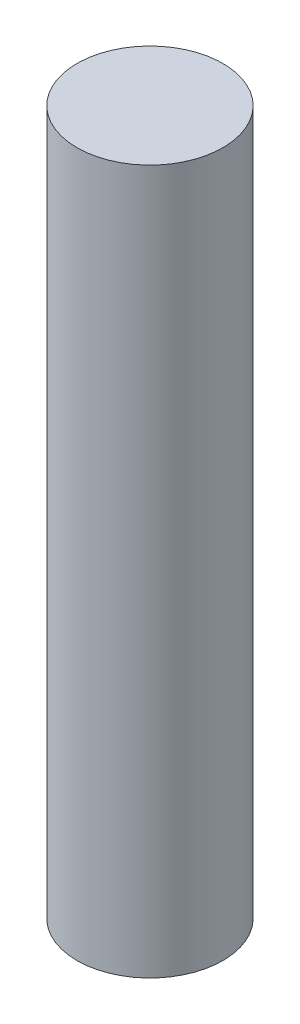
ISO-10303-21;
HEADER;
FILE_DESCRIPTION(('STEP AP214'),'2;1');
FILE_NAME('part.step','',(''),(''),'','','');
FILE_SCHEMA(('AUTOMOTIVE_DESIGN { 1 0 10303 214 1 1 1 1 }'));
ENDSEC;
DATA;
#1=APPLICATION_CONTEXT('core data for automotive mechanical design processes');
#2=APPLICATION_PROTOCOL_DEFINITION('international standard','automotive_design',2000,#1);
#3=PRODUCT_CONTEXT('',#1,'mechanical');
#4=PRODUCT('Part','Part','',(#3));
#5=PRODUCT_RELATED_PRODUCT_CATEGORY('part','',(#4));
#6=PRODUCT_DEFINITION_FORMATION('','',#4);
#7=PRODUCT_DEFINITION_CONTEXT('part definition',#1,'design');
#8=PRODUCT_DEFINITION('design','',#6,#7);
#9=PRODUCT_DEFINITION_SHAPE('','',#8);
#10=(LENGTH_UNIT() NAMED_UNIT(*) SI_UNIT(.MILLI.,.METRE.));
#11=(NAMED_UNIT(*) PLANE_ANGLE_UNIT() SI_UNIT($,.RADIAN.));
#12=(NAMED_UNIT(*) SI_UNIT($,.STERADIAN.) SOLID_ANGLE_UNIT());
#13=UNCERTAINTY_MEASURE_WITH_UNIT(LENGTH_MEASURE(1.E-05),#10,'distance_accuracy_value','');
#14=(GEOMETRIC_REPRESENTATION_CONTEXT(3) GLOBAL_UNCERTAINTY_ASSIGNED_CONTEXT((#13)) GLOBAL_UNIT_ASSIGNED_CONTEXT((#10,
#11,#12)) REPRESENTATION_CONTEXT('',''));
#15=CARTESIAN_POINT('',(0.,0.,0.));
#16=DIRECTION('',(0.,0.,1.));
#17=DIRECTION('',(1.,0.,0.));
#18=AXIS2_PLACEMENT_3D('',#15,#16,#17);
#19=CARTESIAN_POINT('',(0.,-287.89503,0.));
#20=DIRECTION('',(0.,1.,0.));
#21=DIRECTION('',(0.,0.,1.));
#22=AXIS2_PLACEMENT_3D('',#19,#20,#21);
#23=CYLINDRICAL_SURFACE('',#22,29.840301);
#24=CARTESIAN_POINT('',(0.,-287.89503,0.));
#25=DIRECTION('',(0.,1.,0.));
#26=DIRECTION('',(0.,0.,1.));
#27=AXIS2_PLACEMENT_3D('',#24,#25,#26);
#28=CIRCLE('',#27,29.840301);
#29=CARTESIAN_POINT('',(0.,-287.89503,29.840301));
#30=VERTEX_POINT('',#29);
#31=EDGE_CURVE('E10',#30,#30,#28,.T.);
#32=ORIENTED_EDGE('',*,*,#31,.T.);
#33=EDGE_LOOP('',(#32));
#34=FACE_BOUND('',#33,.T.);
#35=CARTESIAN_POINT('',(0.,0.,0.));
#36=DIRECTION('',(0.,1.,0.));
#37=DIRECTION('',(0.,0.,1.));
#38=AXIS2_PLACEMENT_3D('',#35,#36,#37);
#39=CIRCLE('',#38,29.840301);
#40=CARTESIAN_POINT('',(0.,0.,29.840301));
#41=VERTEX_POINT('',#40);
#42=EDGE_CURVE('E34',#41,#41,#39,.T.);
#43=ORIENTED_EDGE('',*,*,#42,.F.);
#44=EDGE_LOOP('',(#43));
#45=FACE_BOUND('',#44,.T.);
#46=ADVANCED_FACE('F31',(#34,#45),#23,.T.);
#47=CARTESIAN_POINT('',(0.,-287.89503,0.));
#48=DIRECTION('',(0.,1.,0.));
#49=DIRECTION('',(0.,0.,1.));
#50=AXIS2_PLACEMENT_3D('',#47,#48,#49);
#51=PLANE('',#50);
#52=ORIENTED_EDGE('',*,*,#31,.F.);
#53=EDGE_LOOP('',(#52));
#54=FACE_BOUND('',#53,.T.);
#55=ADVANCED_FACE('F46',(#54),#51,.F.);
#56=CARTESIAN_POINT('',(0.,0.,0.));
#57=DIRECTION('',(0.,1.,0.));
#58=DIRECTION('',(0.,0.,1.));
#59=AXIS2_PLACEMENT_3D('',#56,#57,#58);
#60=PLANE('',#59);
#61=ORIENTED_EDGE('',*,*,#42,.T.);
#62=EDGE_LOOP('',(#61));
#63=FACE_BOUND('',#62,.T.);
#64=ADVANCED_FACE('F43',(#63),#60,.T.);
#65=CLOSED_SHELL('',(#46,#55,#64));
#66=MANIFOLD_SOLID_BREP('B2',#65);
#67=ADVANCED_BREP_SHAPE_REPRESENTATION('',(#18,#66),#14);
#68=SHAPE_DEFINITION_REPRESENTATION(#9,#67);
ENDSEC;
END-ISO-10303-21;
